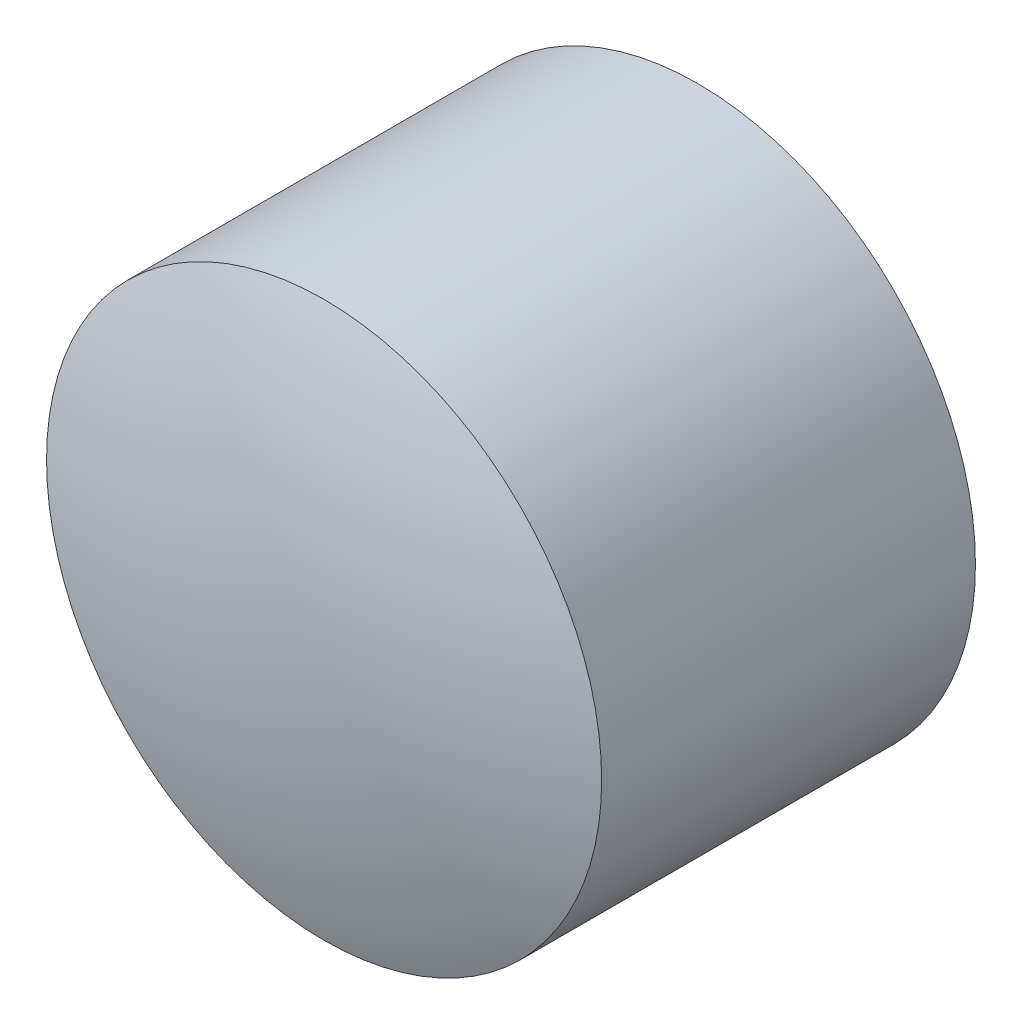
ISO-10303-21;
HEADER;
FILE_DESCRIPTION(('STEP AP214'),'2;1');
FILE_NAME('part.step','',(''),(''),'','','');
FILE_SCHEMA(('AUTOMOTIVE_DESIGN { 1 0 10303 214 1 1 1 1 }'));
ENDSEC;
DATA;
#1=APPLICATION_CONTEXT('core data for automotive mechanical design processes');
#2=APPLICATION_PROTOCOL_DEFINITION('international standard','automotive_design',2000,#1);
#3=PRODUCT_CONTEXT('',#1,'mechanical');
#4=PRODUCT('Part','Part','',(#3));
#5=PRODUCT_RELATED_PRODUCT_CATEGORY('part','',(#4));
#6=PRODUCT_DEFINITION_FORMATION('','',#4);
#7=PRODUCT_DEFINITION_CONTEXT('part definition',#1,'design');
#8=PRODUCT_DEFINITION('design','',#6,#7);
#9=PRODUCT_DEFINITION_SHAPE('','',#8);
#10=(LENGTH_UNIT() NAMED_UNIT(*) SI_UNIT(.MILLI.,.METRE.));
#11=(NAMED_UNIT(*) PLANE_ANGLE_UNIT() SI_UNIT($,.RADIAN.));
#12=(NAMED_UNIT(*) SI_UNIT($,.STERADIAN.) SOLID_ANGLE_UNIT());
#13=UNCERTAINTY_MEASURE_WITH_UNIT(LENGTH_MEASURE(1.E-05),#10,'distance_accuracy_value','');
#14=(GEOMETRIC_REPRESENTATION_CONTEXT(3) GLOBAL_UNCERTAINTY_ASSIGNED_CONTEXT((#13)) GLOBAL_UNIT_ASSIGNED_CONTEXT((#10,
#11,#12)) REPRESENTATION_CONTEXT('',''));
#15=CARTESIAN_POINT('',(0.,0.,0.));
#16=DIRECTION('',(0.,0.,1.));
#17=DIRECTION('',(1.,0.,0.));
#18=AXIS2_PLACEMENT_3D('',#15,#16,#17);
#19=CARTESIAN_POINT('',(0.,0.,-5.));
#20=DIRECTION('',(0.,0.,-1.));
#21=DIRECTION('',(0.,1.,0.));
#22=AXIS2_PLACEMENT_3D('',#19,#20,#21);
#23=SPHERICAL_SURFACE('',#22,6.32579046444);
#24=CARTESIAN_POINT('',(0.,0.,0.));
#25=DIRECTION('',(0.,0.,-1.));
#26=DIRECTION('',(0.,1.,0.));
#27=AXIS2_PLACEMENT_3D('',#24,#25,#26);
#28=CIRCLE('',#27,3.875);
#29=CARTESIAN_POINT('',(0.,3.875,0.));
#30=VERTEX_POINT('',#29);
#31=EDGE_CURVE('E10',#30,#30,#28,.T.);
#32=ORIENTED_EDGE('',*,*,#31,.T.);
#33=EDGE_LOOP('',(#32));
#34=FACE_BOUND('',#33,.T.);
#35=ADVANCED_FACE('F42',(#34),#23,.F.);
#36=CARTESIAN_POINT('',(0.,0.,0.));
#37=DIRECTION('',(0.,0.,-1.));
#38=DIRECTION('',(0.,1.,0.));
#39=AXIS2_PLACEMENT_3D('',#36,#37,#38);
#40=CYLINDRICAL_SURFACE('',#39,3.875);
#41=CARTESIAN_POINT('',(0.,0.,5.21869703374615));
#42=DIRECTION('',(0.,0.,-1.));
#43=DIRECTION('',(0.,1.,0.));
#44=AXIS2_PLACEMENT_3D('',#41,#42,#43);
#45=CIRCLE('',#44,3.875);
#46=CARTESIAN_POINT('',(0.,3.875,5.21869703374615));
#47=VERTEX_POINT('',#46);
#48=EDGE_CURVE('E49',#47,#47,#45,.T.);
#49=ORIENTED_EDGE('',*,*,#48,.T.);
#50=EDGE_LOOP('',(#49));
#51=FACE_BOUND('',#50,.T.);
#52=ORIENTED_EDGE('',*,*,#31,.F.);
#53=EDGE_LOOP('',(#52));
#54=FACE_BOUND('',#53,.T.);
#55=ADVANCED_FACE('F56',(#51,#54),#40,.T.);
#56=CARTESIAN_POINT('',(0.,0.,-5.));
#57=DIRECTION('',(0.,0.,-1.));
#58=DIRECTION('',(0.,1.,0.));
#59=AXIS2_PLACEMENT_3D('',#56,#57,#58);
#60=SPHERICAL_SURFACE('',#59,10.9287416506884);
#61=ORIENTED_EDGE('',*,*,#48,.F.);
#62=EDGE_LOOP('',(#61));
#63=FACE_BOUND('',#62,.T.);
#64=ADVANCED_FACE('F59',(#63),#60,.T.);
#65=CLOSED_SHELL('',(#35,#55,#64));
#66=MANIFOLD_SOLID_BREP('B2',#65);
#67=ADVANCED_BREP_SHAPE_REPRESENTATION('',(#18,#66),#14);
#68=SHAPE_DEFINITION_REPRESENTATION(#9,#67);
ENDSEC;
END-ISO-10303-21;
